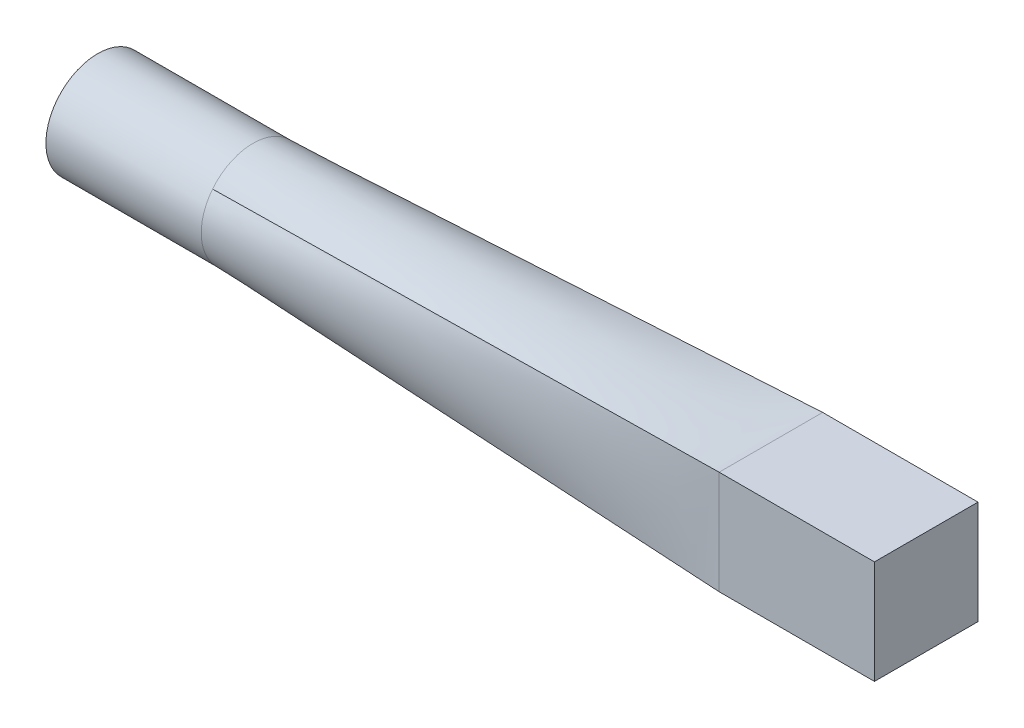
ISO-10303-21;
HEADER;
FILE_DESCRIPTION(('STEP AP214'),'2;1');
FILE_NAME('part.step','',(''),(''),'','','');
FILE_SCHEMA(('AUTOMOTIVE_DESIGN { 1 0 10303 214 1 1 1 1 }'));
ENDSEC;
DATA;
#1=APPLICATION_CONTEXT('core data for automotive mechanical design processes');
#2=APPLICATION_PROTOCOL_DEFINITION('international standard','automotive_design',2000,#1);
#3=PRODUCT_CONTEXT('',#1,'mechanical');
#4=PRODUCT('Part','Part','',(#3));
#5=PRODUCT_RELATED_PRODUCT_CATEGORY('part','',(#4));
#6=PRODUCT_DEFINITION_FORMATION('','',#4);
#7=PRODUCT_DEFINITION_CONTEXT('part definition',#1,'design');
#8=PRODUCT_DEFINITION('design','',#6,#7);
#9=PRODUCT_DEFINITION_SHAPE('','',#8);
#10=(LENGTH_UNIT() NAMED_UNIT(*) SI_UNIT(.MILLI.,.METRE.));
#11=(NAMED_UNIT(*) PLANE_ANGLE_UNIT() SI_UNIT($,.RADIAN.));
#12=(NAMED_UNIT(*) SI_UNIT($,.STERADIAN.) SOLID_ANGLE_UNIT());
#13=UNCERTAINTY_MEASURE_WITH_UNIT(LENGTH_MEASURE(1.E-05),#10,'distance_accuracy_value','');
#14=(GEOMETRIC_REPRESENTATION_CONTEXT(3) GLOBAL_UNCERTAINTY_ASSIGNED_CONTEXT((#13)) GLOBAL_UNIT_ASSIGNED_CONTEXT((#10,
#11,#12)) REPRESENTATION_CONTEXT('',''));
#15=CARTESIAN_POINT('',(0.,0.,0.));
#16=DIRECTION('',(0.,0.,1.));
#17=DIRECTION('',(1.,0.,0.));
#18=AXIS2_PLACEMENT_3D('',#15,#16,#17);
#19=CARTESIAN_POINT('',(1020.85832331262,102.108,102.108));
#20=CARTESIAN_POINT('',(680.378560960894,89.3341206385624,94.649650798203));
#21=CARTESIAN_POINT('',(339.898798609163,76.5602412771248,87.191301596406));
#22=CARTESIAN_POINT('',(-0.580963742567401,63.7863619156871,79.7329523946089));
#23=CARTESIAN_POINT('',(1020.85832331262,102.108,93.1714961454021));
#24=CARTESIAN_POINT('',(680.378560960894,91.2313128502488,87.1742277924552));
#25=CARTESIAN_POINT('',(339.898798609163,80.3546257004976,81.1769594395084));
#26=CARTESIAN_POINT('',(-0.580963742567401,69.4779385507464,75.1796910865616));
#27=CARTESIAN_POINT('',(1020.85832331262,102.108,75.7627085856291));
#28=CARTESIAN_POINT('',(680.378560960894,94.780774380712,72.0581179502453));
#29=CARTESIAN_POINT('',(339.898798609163,87.4535487614239,68.3535273148614));
#30=CARTESIAN_POINT('',(-0.580963742567402,80.1263231421359,64.6489366794776));
#31=CARTESIAN_POINT('',(1020.85832331262,102.108,54.6303952968601));
#32=CARTESIAN_POINT('',(680.378560960894,98.2373456468872,52.5513697085426));
#33=CARTESIAN_POINT('',(339.898798609163,94.3666912937744,50.4723441202251));
#34=CARTESIAN_POINT('',(-0.5809637425674,90.4960369406616,48.3933185319076));
#35=CARTESIAN_POINT('',(1020.85832331262,102.108,37.8649403420387));
#36=CARTESIAN_POINT('',(680.378560960894,100.23155182152,36.6096044345778));
#37=CARTESIAN_POINT('',(339.898798609163,98.3551036430404,35.3542685271169));
#38=CARTESIAN_POINT('',(-0.580963742567402,96.4786554645606,34.098932619656));
#39=CARTESIAN_POINT('',(1020.85832331262,102.108,25.3075183608059));
#40=CARTESIAN_POINT('',(680.378560960894,101.314918014343,24.5125273779682));
#41=CARTESIAN_POINT('',(339.898798609163,100.521836028686,23.7175363951305));
#42=CARTESIAN_POINT('',(-0.580963742567402,99.7287540430287,22.9225454122928));
#43=CARTESIAN_POINT('',(1020.85832331262,102.108,12.7132370112428));
#44=CARTESIAN_POINT('',(680.378560960894,101.965223533637,12.302421457231));
#45=CARTESIAN_POINT('',(339.898798609163,101.822447067274,11.8916059032192));
#46=CARTESIAN_POINT('',(-0.580963742567401,101.679670600911,11.4807903492074));
#47=CARTESIAN_POINT('',(1020.85832331262,102.108,4.25450000000002));
#48=CARTESIAN_POINT('',(680.378560960894,102.108,4.10708919991509));
#49=CARTESIAN_POINT('',(339.898798609163,102.108,3.95967839983017));
#50=CARTESIAN_POINT('',(-0.580963742567401,102.108,3.81226759974524));
#51=CARTESIAN_POINT('',(1020.85832331262,102.108,-4.2545));
#52=CARTESIAN_POINT('',(680.378560960894,102.108,-4.10708919991508));
#53=CARTESIAN_POINT('',(339.898798609163,102.108,-3.95967839983016));
#54=CARTESIAN_POINT('',(-0.580963742567401,102.108,-3.81226759974524));
#55=CARTESIAN_POINT('',(1020.85832331262,102.108,-12.7132370112428));
#56=CARTESIAN_POINT('',(680.378560960894,101.965223533637,-12.302421457231));
#57=CARTESIAN_POINT('',(339.898798609163,101.822447067274,-11.8916059032192));
#58=CARTESIAN_POINT('',(-0.580963742567401,101.679670600912,-11.4807903492074));
#59=CARTESIAN_POINT('',(1020.85832331262,102.108,-25.3075183608059));
#60=CARTESIAN_POINT('',(680.378560960894,101.314918014343,-24.5125273779682));
#61=CARTESIAN_POINT('',(339.898798609163,100.521836028686,-23.7175363951305));
#62=CARTESIAN_POINT('',(-0.580963742567401,99.7287540430285,-22.9225454122928));
#63=CARTESIAN_POINT('',(1020.85832331262,102.108,-37.8649403420387));
#64=CARTESIAN_POINT('',(680.378560960894,100.23155182152,-36.6096044345778));
#65=CARTESIAN_POINT('',(339.898798609163,98.3551036430405,-35.3542685271169));
#66=CARTESIAN_POINT('',(-0.580963742567402,96.4786554645607,-34.098932619656));
#67=CARTESIAN_POINT('',(1020.85832331262,102.108,-54.6303952968601));
#68=CARTESIAN_POINT('',(680.378560960894,98.2373456468873,-52.5513697085426));
#69=CARTESIAN_POINT('',(339.898798609163,94.3666912937745,-50.4723441202251));
#70=CARTESIAN_POINT('',(-0.5809637425674,90.4960369406616,-48.3933185319076));
#71=CARTESIAN_POINT('',(1020.85832331262,102.108,-75.7627085856291));
#72=CARTESIAN_POINT('',(680.378560960894,94.7807743807119,-72.0581179502453));
#73=CARTESIAN_POINT('',(339.898798609163,87.4535487614239,-68.3535273148615));
#74=CARTESIAN_POINT('',(-0.580963742567402,80.1263231421358,-64.6489366794777));
#75=CARTESIAN_POINT('',(1020.85832331262,102.108,-93.1714961454021));
#76=CARTESIAN_POINT('',(680.378560960894,91.2313128502488,-87.1742277924552));
#77=CARTESIAN_POINT('',(339.898798609163,80.3546257004976,-81.1769594395084));
#78=CARTESIAN_POINT('',(-0.580963742567401,69.4779385507464,-75.1796910865616));
#79=CARTESIAN_POINT('',(1020.85832331262,102.108,-102.108));
#80=CARTESIAN_POINT('',(680.378560960894,89.3341206385624,-94.649650798203));
#81=CARTESIAN_POINT('',(339.898798609163,76.5602412771248,-87.191301596406));
#82=CARTESIAN_POINT('',(-0.580963742567401,63.7863619156871,-79.732952394609));
#83=B_SPLINE_SURFACE_WITH_KNOTS('',3,3,((#19,#20,#21,#22),(#23,#24,#25,#26),(#27,#28,#29,#30),
(#31,#32,#33,#34),(#35,#36,#37,#38),(#39,#40,#41,#42),(#43,#44,#45,#46),(#47,#48,#49,#50),(#51,
#52,#53,#54),(#55,#56,#57,#58),(#59,#60,#61,#62),(#63,#64,#65,#66),(#67,#68,#69,#70),(#71,#72,
#73,#74),(#75,#76,#77,#78),(#79,#80,#81,#82)),.UNSPECIFIED.,.F.,.F.,.F.,(4,1,1,1,1,1,2,1,1,1,1,
1,4),(4,4),(0.732388356261361,0.765839811728691,0.799291267196021,0.816016994929686,
0.832742722663351,0.849468450397016,0.866194178130681,0.882919905864346,0.899645633598011,
0.916371361331675,0.93309708906534,0.96654854453267,1.),(0.,1.),.UNSPECIFIED.);
#84=DIRECTION('',(0.,0.,1.));
#85=VECTOR('',#84,1.);
#86=CARTESIAN_POINT('',(1020.85832331262,102.108,102.108));
#87=LINE('',#86,#85);
#88=CARTESIAN_POINT('',(1020.85832331262,102.108,-102.108));
#89=VERTEX_POINT('',#88);
#90=CARTESIAN_POINT('',(1020.85832331262,102.108,102.108));
#91=VERTEX_POINT('',#90);
#92=EDGE_CURVE('E190',#89,#91,#87,.T.);
#93=CARTESIAN_POINT('',(1020.85832331262,102.108,-102.108));
#94=CARTESIAN_POINT('',(680.378560960894,89.3341206385624,-94.649650798203));
#95=CARTESIAN_POINT('',(339.898798609163,76.5602412771248,-87.191301596406));
#96=CARTESIAN_POINT('',(-0.580963742567401,63.7863619156871,-79.732952394609));
#97=B_SPLINE_CURVE_WITH_KNOTS('',3,(#93,#94,#95,#96),.UNSPECIFIED.,.F.,.F.,(4,4),(0.,1.),.UNSPECIFIED.);
#98=CARTESIAN_POINT('',(-0.580963742567449,63.7867207358641,-79.7334010755995));
#99=VERTEX_POINT('',#98);
#100=EDGE_CURVE('E176',#89,#99,#97,.T.);
#101=CARTESIAN_POINT('',(-0.580963742567401,0.,0.));
#102=DIRECTION('',(1.,0.,0.));
#103=DIRECTION('',(0.,0.,-1.));
#104=AXIS2_PLACEMENT_3D('',#101,#102,#103);
#105=CIRCLE('',#104,102.108);
#106=CARTESIAN_POINT('',(-0.580963742567449,63.7867199650152,79.7334001299436));
#107=VERTEX_POINT('',#106);
#108=EDGE_CURVE('E167',#99,#107,#105,.T.);
#109=CARTESIAN_POINT('',(1020.85832331262,102.108,102.108));
#110=CARTESIAN_POINT('',(680.378560960894,89.3341206385624,94.649650798203));
#111=CARTESIAN_POINT('',(339.898798609163,76.5602412771248,87.191301596406));
#112=CARTESIAN_POINT('',(-0.580963742567401,63.7863619156871,79.7329523946089));
#113=B_SPLINE_CURVE_WITH_KNOTS('',3,(#109,#110,#111,#112),.UNSPECIFIED.,.F.,.F.,(4,4),(0.,1.),.UNSPECIFIED.);
#114=EDGE_CURVE('E192',#91,#107,#113,.T.);
#115=ORIENTED_EDGE('',*,*,#92,.F.);
#116=ORIENTED_EDGE('',*,*,#100,.T.);
#117=ORIENTED_EDGE('',*,*,#108,.T.);
#118=ORIENTED_EDGE('',*,*,#114,.F.);
#119=EDGE_LOOP('',(#115,#116,#117,#118));
#120=FACE_BOUND('',#119,.T.);
#121=ADVANCED_FACE('F115',(#120),#83,.T.);
#122=CARTESIAN_POINT('',(1020.85832331262,-102.108,102.108));
#123=CARTESIAN_POINT('',(680.378560960894,-94.2191794723762,89.8613162269803));
#124=CARTESIAN_POINT('',(339.898798609163,-86.3303589447525,77.6146324539605));
#125=CARTESIAN_POINT('',(-0.580963742567401,-78.4415384171288,65.3679486809408));
#126=CARTESIAN_POINT('',(1020.85832331262,-93.5989999999999,102.108));
#127=CARTESIAN_POINT('',(680.378560960894,-87.1385607456465,91.550858699056));
#128=CARTESIAN_POINT('',(339.898798609163,-80.678121491293,80.9937173981119));
#129=CARTESIAN_POINT('',(-0.580963742567401,-74.2176822369396,70.4365760971678));
#130=CARTESIAN_POINT('',(1020.85832331262,-76.5809999999999,102.108));
#131=CARTESIAN_POINT('',(680.378560960894,-72.6489037847377,94.6561958005782));
#132=CARTESIAN_POINT('',(339.898798609163,-68.7168075694755,87.2043916011564));
#133=CARTESIAN_POINT('',(-0.5809637425674,-64.7847113542132,79.7525874017347));
#134=CARTESIAN_POINT('',(1020.85832331262,-51.0539999999999,102.108));
#135=CARTESIAN_POINT('',(680.378560960894,-50.1052357931439,98.3182201109129));
#136=CARTESIAN_POINT('',(339.898798609163,-49.1564715862879,94.5284402218259));
#137=CARTESIAN_POINT('',(-0.580963742567404,-48.2077073794319,90.7386603327388));
#138=CARTESIAN_POINT('',(1020.85832331262,-25.5269999999999,102.108));
#139=CARTESIAN_POINT('',(680.378560960893,-26.9597121321166,100.847280584255));
#140=CARTESIAN_POINT('',(339.898798609163,-28.3924242642332,99.5865611685106));
#141=CARTESIAN_POINT('',(-0.580963742567398,-29.8251363963499,98.3258417527659));
#142=CARTESIAN_POINT('',(1020.85832331262,1.11889664200504E-13,102.108));
#143=CARTESIAN_POINT('',(680.378560960893,-3.44172585983409,102.148527394115));
#144=CARTESIAN_POINT('',(339.898798609163,-6.8834517196683,102.189054788229));
#145=CARTESIAN_POINT('',(-0.580963742567405,-10.3251775795025,102.229582182344));
#146=CARTESIAN_POINT('',(1020.85832331262,25.5270000000001,102.108));
#147=CARTESIAN_POINT('',(680.378560960893,20.2051843994744,102.173297821319));
#148=CARTESIAN_POINT('',(339.898798609163,14.8833687989486,102.238595642638));
#149=CARTESIAN_POINT('',(-0.5809637425674,9.5615531984229,102.303893463957));
#150=CARTESIAN_POINT('',(1020.85832331262,51.0540000000001,102.108));
#151=CARTESIAN_POINT('',(680.378560960894,43.7326679154101,100.920573809402));
#152=CARTESIAN_POINT('',(339.898798609163,36.4113358308201,99.7331476188032));
#153=CARTESIAN_POINT('',(-0.580963742567403,29.09000374623,98.5457214282048));
#154=CARTESIAN_POINT('',(1020.85832331262,76.581,102.108));
#155=CARTESIAN_POINT('',(680.378560960894,66.8969982660708,98.4374201646683));
#156=CARTESIAN_POINT('',(339.898798609163,57.2129965321415,94.7668403293366));
#157=CARTESIAN_POINT('',(-0.580963742567401,47.5289947982123,91.096260494005));
#158=CARTESIAN_POINT('',(1020.85832331262,93.599,102.108));
#159=CARTESIAN_POINT('',(680.378560960894,81.9440958958937,96.0235372590046));
#160=CARTESIAN_POINT('',(339.898798609163,70.2891917917873,89.9390745180092));
#161=CARTESIAN_POINT('',(-0.580963742567401,58.634287687681,83.8546117770139));
#162=CARTESIAN_POINT('',(1020.85832331262,102.108,102.108));
#163=CARTESIAN_POINT('',(680.378560960894,89.3341206385624,94.649650798203));
#164=CARTESIAN_POINT('',(339.898798609163,76.5602412771248,87.191301596406));
#165=CARTESIAN_POINT('',(-0.580963742567401,63.7863619156871,79.7329523946089));
#166=B_SPLINE_SURFACE_WITH_KNOTS('',3,3,((#122,#123,#124,#125),(#126,#127,#128,#129),(#130,#131,
#132,#133),(#134,#135,#136,#137),(#138,#139,#140,#141),(#142,#143,#144,#145),(#146,#147,#148,
#149),(#150,#151,#152,#153),(#154,#155,#156,#157),(#158,#159,#160,#161),(#162,#163,#164,#165)),
.UNSPECIFIED.,.F.,.F.,.F.,(4,1,1,1,1,1,1,1,4),(4,4),(0.483979693536605,0.515030776377199,
0.546081859217794,0.577132942058388,0.608184024898983,0.639235107739578,0.670286190580172,
0.701337273420767,0.732388356261361),(0.,1.),.UNSPECIFIED.);
#167=DIRECTION('',(0.,-1.,0.));
#168=VECTOR('',#167,1.);
#169=CARTESIAN_POINT('',(1020.85832331262,-102.108,102.108));
#170=LINE('',#169,#168);
#171=CARTESIAN_POINT('',(1020.85832331262,-102.108,102.108));
#172=VERTEX_POINT('',#171);
#173=EDGE_CURVE('E271',#91,#172,#170,.T.);
#174=CARTESIAN_POINT('',(-0.580963742567449,-78.4419910130422,65.3683259191906));
#175=VERTEX_POINT('',#174);
#176=EDGE_CURVE('E13',#107,#175,#105,.T.);
#177=CARTESIAN_POINT('',(1020.85832331262,-102.108,102.108));
#178=CARTESIAN_POINT('',(680.378560960894,-94.2191794723762,89.8613162269803));
#179=CARTESIAN_POINT('',(339.898798609163,-86.3303589447525,77.6146324539605));
#180=CARTESIAN_POINT('',(-0.580963742567401,-78.4415384171288,65.3679486809408));
#181=B_SPLINE_CURVE_WITH_KNOTS('',3,(#177,#178,#179,#180),.UNSPECIFIED.,.F.,.F.,(4,4),(0.,1.),.UNSPECIFIED.);
#182=EDGE_CURVE('E194',#172,#175,#181,.T.);
#183=ORIENTED_EDGE('',*,*,#173,.F.);
#184=ORIENTED_EDGE('',*,*,#114,.T.);
#185=ORIENTED_EDGE('',*,*,#176,.T.);
#186=ORIENTED_EDGE('',*,*,#182,.F.);
#187=EDGE_LOOP('',(#183,#184,#185,#186));
#188=FACE_BOUND('',#187,.T.);
#189=ADVANCED_FACE('F333',(#188),#166,.T.);
#190=CARTESIAN_POINT('',(1020.85832331262,-102.108,-102.108));
#191=CARTESIAN_POINT('',(680.378560960894,-94.2191794723762,-89.8613162269802));
#192=CARTESIAN_POINT('',(339.898798609163,-86.3303589447525,-77.6146324539604));
#193=CARTESIAN_POINT('',(-0.580963742567401,-78.4415384171289,-65.3679486809407));
#194=CARTESIAN_POINT('',(1020.85832331262,-102.108,-93.599));
#195=CARTESIAN_POINT('',(680.378560960894,-95.4806687955508,-82.6748623725041));
#196=CARTESIAN_POINT('',(339.898798609163,-88.8533375911017,-71.7507247450082));
#197=CARTESIAN_POINT('',(-0.580963742567401,-82.2260063866526,-60.8265871175122));
#198=CARTESIAN_POINT('',(1020.85832331262,-102.108,-76.581));
#199=CARTESIAN_POINT('',(680.378560960894,-97.740105900417,-68.0823739923743));
#200=CARTESIAN_POINT('',(339.898798609163,-93.3722118008341,-59.5837479847486));
#201=CARTESIAN_POINT('',(-0.580963742567401,-89.0043177012512,-51.085121977123));
#202=CARTESIAN_POINT('',(1020.85832331262,-102.108,-51.054));
#203=CARTESIAN_POINT('',(680.378560960894,-100.236419088233,-45.6811188602736));
#204=CARTESIAN_POINT('',(339.898798609163,-98.3648381764663,-40.3082377205471));
#205=CARTESIAN_POINT('',(-0.580963742567401,-96.4932572646995,-34.9353565808207));
#206=CARTESIAN_POINT('',(1020.85832331262,-102.108,-25.527));
#207=CARTESIAN_POINT('',(680.378560960894,-101.764942367677,-22.9295112801348));
#208=CARTESIAN_POINT('',(339.898798609163,-101.421884735355,-20.3320225602695));
#209=CARTESIAN_POINT('',(-0.580963742567403,-101.078827103032,-17.7345338404043));
#210=CARTESIAN_POINT('',(1020.85832331262,-102.108,0.));
#211=CARTESIAN_POINT('',(680.378560960893,-102.27959121097,0.));
#212=CARTESIAN_POINT('',(339.898798609163,-102.45118242194,0.));
#213=CARTESIAN_POINT('',(-0.580963742567399,-102.62277363291,0.));
#214=CARTESIAN_POINT('',(1020.85832331262,-102.108,25.527));
#215=CARTESIAN_POINT('',(680.378560960893,-101.764942367677,22.9295112801348));
#216=CARTESIAN_POINT('',(339.898798609163,-101.421884735355,20.3320225602696));
#217=CARTESIAN_POINT('',(-0.580963742567405,-101.078827103032,17.7345338404044));
#218=CARTESIAN_POINT('',(1020.85832331262,-102.108,51.054));
#219=CARTESIAN_POINT('',(680.378560960894,-100.236419088233,45.6811188602736));
#220=CARTESIAN_POINT('',(339.898798609163,-98.3648381764663,40.3082377205473));
#221=CARTESIAN_POINT('',(-0.580963742567399,-96.4932572646995,34.9353565808209));
#222=CARTESIAN_POINT('',(1020.85832331262,-102.108,76.581));
#223=CARTESIAN_POINT('',(680.378560960893,-97.740105900417,68.0823739923743));
#224=CARTESIAN_POINT('',(339.898798609163,-93.3722118008341,59.5837479847486));
#225=CARTESIAN_POINT('',(-0.580963742567403,-89.0043177012512,51.0851219771229));
#226=CARTESIAN_POINT('',(1020.85832331262,-102.108,93.599));
#227=CARTESIAN_POINT('',(680.378560960893,-95.4806687955508,82.6748623725041));
#228=CARTESIAN_POINT('',(339.898798609163,-88.8533375911016,71.7507247450082));
#229=CARTESIAN_POINT('',(-0.580963742567401,-82.2260063866525,60.8265871175123));
#230=CARTESIAN_POINT('',(1020.85832331262,-102.108,102.108));
#231=CARTESIAN_POINT('',(680.378560960894,-94.2191794723762,89.8613162269803));
#232=CARTESIAN_POINT('',(339.898798609163,-86.3303589447525,77.6146324539605));
#233=CARTESIAN_POINT('',(-0.580963742567401,-78.4415384171288,65.3679486809408));
#234=B_SPLINE_SURFACE_WITH_KNOTS('',3,3,((#190,#191,#192,#193),(#194,#195,#196,#197),(#198,#199,
#200,#201),(#202,#203,#204,#205),(#206,#207,#208,#209),(#210,#211,#212,#213),(#214,#215,#216,
#217),(#218,#219,#220,#221),(#222,#223,#224,#225),(#226,#227,#228,#229),(#230,#231,#232,#233)),
.UNSPECIFIED.,.F.,.F.,.F.,(4,1,1,1,1,1,1,1,4),(4,4),(0.248408662724757,0.277855041576238,
0.307301420427719,0.3367477992792,0.366194178130681,0.395640556982162,0.425086935833643,
0.454533314685124,0.483979693536605),(0.,1.),.UNSPECIFIED.);
#235=DIRECTION('',(0.,0.,-1.));
#236=VECTOR('',#235,1.);
#237=CARTESIAN_POINT('',(1020.85832331262,-102.108,102.108));
#238=LINE('',#237,#236);
#239=CARTESIAN_POINT('',(1020.85832331262,-102.108,-102.108));
#240=VERTEX_POINT('',#239);
#241=EDGE_CURVE('E302',#172,#240,#238,.T.);
#242=CARTESIAN_POINT('',(-0.580963742567449,-78.4419888320104,-65.368324117985));
#243=VERTEX_POINT('',#242);
#244=EDGE_CURVE('E128',#175,#243,#105,.T.);
#245=CARTESIAN_POINT('',(1020.85832331262,-102.108,-102.108));
#246=CARTESIAN_POINT('',(680.378560960894,-94.2191794723762,-89.8613162269802));
#247=CARTESIAN_POINT('',(339.898798609163,-86.3303589447525,-77.6146324539604));
#248=CARTESIAN_POINT('',(-0.580963742567401,-78.4415384171289,-65.3679486809407));
#249=B_SPLINE_CURVE_WITH_KNOTS('',3,(#245,#246,#247,#248),.UNSPECIFIED.,.F.,.F.,(4,4),(0.,1.),.UNSPECIFIED.);
#250=EDGE_CURVE('E186',#240,#243,#249,.T.);
#251=ORIENTED_EDGE('',*,*,#241,.F.);
#252=ORIENTED_EDGE('',*,*,#182,.T.);
#253=ORIENTED_EDGE('',*,*,#244,.T.);
#254=ORIENTED_EDGE('',*,*,#250,.F.);
#255=EDGE_LOOP('',(#251,#252,#253,#254));
#256=FACE_BOUND('',#255,.T.);
#257=ADVANCED_FACE('F227',(#256),#234,.T.);
#258=CARTESIAN_POINT('',(1020.85832331262,102.108,-102.108));
#259=CARTESIAN_POINT('',(680.378560960894,89.3341206385624,-94.649650798203));
#260=CARTESIAN_POINT('',(339.898798609163,76.5602412771248,-87.191301596406));
#261=CARTESIAN_POINT('',(-0.580963742567401,63.7863619156871,-79.732952394609));
#262=CARTESIAN_POINT('',(1020.85832331262,93.5990000000001,-102.108));
#263=CARTESIAN_POINT('',(680.378560960894,81.9440958958937,-96.0235372590046));
#264=CARTESIAN_POINT('',(339.898798609163,70.2891917917873,-89.9390745180092));
#265=CARTESIAN_POINT('',(-0.580963742567401,58.634287687681,-83.8546117770139));
#266=CARTESIAN_POINT('',(1020.85832331262,76.581,-102.108));
#267=CARTESIAN_POINT('',(680.378560960894,66.8969982660708,-98.4374201646683));
#268=CARTESIAN_POINT('',(339.898798609163,57.2129965321415,-94.7668403293366));
#269=CARTESIAN_POINT('',(-0.580963742567401,47.5289947982122,-91.0962604940049));
#270=CARTESIAN_POINT('',(1020.85832331262,51.0540000000001,-102.108));
#271=CARTESIAN_POINT('',(680.378560960894,43.7326679154101,-100.920573809402));
#272=CARTESIAN_POINT('',(339.898798609163,36.4113358308201,-99.7331476188033));
#273=CARTESIAN_POINT('',(-0.580963742567403,29.0900037462301,-98.545721428205));
#274=CARTESIAN_POINT('',(1020.85832331262,25.5270000000001,-102.108));
#275=CARTESIAN_POINT('',(680.378560960894,20.2051843994743,-102.173297821319));
#276=CARTESIAN_POINT('',(339.898798609163,14.8833687989486,-102.238595642638));
#277=CARTESIAN_POINT('',(-0.5809637425674,9.56155319842282,-102.303893463957));
#278=CARTESIAN_POINT('',(1020.85832331262,0.,-102.108));
#279=CARTESIAN_POINT('',(680.378560960893,-3.44172585983412,-102.148527394114));
#280=CARTESIAN_POINT('',(339.898798609163,-6.88345171966832,-102.189054788229));
#281=CARTESIAN_POINT('',(-0.580963742567404,-10.3251775795025,-102.229582182343));
#282=CARTESIAN_POINT('',(1020.85832331262,-25.5269999999999,-102.108));
#283=CARTESIAN_POINT('',(680.378560960894,-26.9597121321167,-100.847280584255));
#284=CARTESIAN_POINT('',(339.898798609163,-28.3924242642334,-99.5865611685108));
#285=CARTESIAN_POINT('',(-0.580963742567399,-29.8251363963502,-98.3258417527663));
#286=CARTESIAN_POINT('',(1020.85832331262,-51.0539999999999,-102.108));
#287=CARTESIAN_POINT('',(680.378560960894,-50.1052357931439,-98.3182201109128));
#288=CARTESIAN_POINT('',(339.898798609163,-49.1564715862878,-94.5284402218256));
#289=CARTESIAN_POINT('',(-0.580963742567402,-48.2077073794318,-90.7386603327383));
#290=CARTESIAN_POINT('',(1020.85832331262,-76.5809999999999,-102.108));
#291=CARTESIAN_POINT('',(680.378560960894,-72.6489037847378,-94.6561958005783));
#292=CARTESIAN_POINT('',(339.898798609163,-68.7168075694756,-87.2043916011567));
#293=CARTESIAN_POINT('',(-0.580963742567401,-64.7847113542134,-79.752587401735));
#294=CARTESIAN_POINT('',(1020.85832331262,-93.5989999999999,-102.108));
#295=CARTESIAN_POINT('',(680.378560960894,-87.1385607456465,-91.5508586990559));
#296=CARTESIAN_POINT('',(339.898798609163,-80.6781214912931,-80.9937173981118));
#297=CARTESIAN_POINT('',(-0.580963742567401,-74.2176822369397,-70.4365760971677));
#298=CARTESIAN_POINT('',(1020.85832331262,-102.108,-102.108));
#299=CARTESIAN_POINT('',(680.378560960894,-94.2191794723762,-89.8613162269802));
#300=CARTESIAN_POINT('',(339.898798609163,-86.3303589447525,-77.6146324539604));
#301=CARTESIAN_POINT('',(-0.580963742567401,-78.4415384171289,-65.3679486809407));
#302=B_SPLINE_SURFACE_WITH_KNOTS('',3,3,((#258,#259,#260,#261),(#262,#263,#264,#265),(#266,#267,
#268,#269),(#270,#271,#272,#273),(#274,#275,#276,#277),(#278,#279,#280,#281),(#282,#283,#284,
#285),(#286,#287,#288,#289),(#290,#291,#292,#293),(#294,#295,#296,#297),(#298,#299,#300,#301)),
.UNSPECIFIED.,.F.,.F.,.F.,(4,1,1,1,1,1,1,1,4),(4,4),(0.,0.0310510828405946,0.0621021656811892,
0.0931532485217838,0.124204331362378,0.155255414202973,0.186306497043568,0.217357579884162,
0.248408662724757),(0.,1.),.UNSPECIFIED.);
#303=DIRECTION('',(0.,1.,0.));
#304=VECTOR('',#303,1.);
#305=CARTESIAN_POINT('',(1020.85832331262,-102.108,-102.108));
#306=LINE('',#305,#304);
#307=EDGE_CURVE('E209',#240,#89,#306,.T.);
#308=EDGE_CURVE('E121',#243,#99,#105,.T.);
#309=ORIENTED_EDGE('',*,*,#307,.F.);
#310=ORIENTED_EDGE('',*,*,#250,.T.);
#311=ORIENTED_EDGE('',*,*,#308,.T.);
#312=ORIENTED_EDGE('',*,*,#100,.F.);
#313=EDGE_LOOP('',(#309,#310,#311,#312));
#314=FACE_BOUND('',#313,.T.);
#315=ADVANCED_FACE('F184',(#314),#302,.T.);
#316=CARTESIAN_POINT('',(1327.18232331262,-102.108,-102.108));
#317=DIRECTION('',(0.,0.,1.));
#318=DIRECTION('',(1.,0.,0.));
#319=AXIS2_PLACEMENT_3D('',#316,#317,#318);
#320=PLANE('',#319);
#321=ORIENTED_EDGE('',*,*,#307,.T.);
#322=DIRECTION('',(-1.,0.,0.));
#323=VECTOR('',#322,1.);
#324=CARTESIAN_POINT('',(1327.18232331262,102.108,-102.108));
#325=LINE('',#324,#323);
#326=CARTESIAN_POINT('',(1327.18232331262,102.108,-102.108));
#327=VERTEX_POINT('',#326);
#328=EDGE_CURVE('E257',#327,#89,#325,.T.);
#329=ORIENTED_EDGE('',*,*,#328,.F.);
#330=DIRECTION('',(0.,1.,0.));
#331=VECTOR('',#330,1.);
#332=CARTESIAN_POINT('',(1327.18232331262,-102.108,-102.108));
#333=LINE('',#332,#331);
#334=CARTESIAN_POINT('',(1327.18232331262,-102.108,-102.108));
#335=VERTEX_POINT('',#334);
#336=EDGE_CURVE('E284',#335,#327,#333,.T.);
#337=ORIENTED_EDGE('',*,*,#336,.F.);
#338=DIRECTION('',(-1.,0.,0.));
#339=VECTOR('',#338,1.);
#340=CARTESIAN_POINT('',(1327.18232331262,-102.108,-102.108));
#341=LINE('',#340,#339);
#342=EDGE_CURVE('E266',#335,#240,#341,.T.);
#343=ORIENTED_EDGE('',*,*,#342,.T.);
#344=EDGE_LOOP('',(#321,#329,#337,#343));
#345=FACE_BOUND('',#344,.T.);
#346=ADVANCED_FACE('F226',(#345),#320,.F.);
#347=CARTESIAN_POINT('',(1327.18232331262,102.108,102.108));
#348=DIRECTION('',(0.,-1.,0.));
#349=DIRECTION('',(0.,0.,-1.));
#350=AXIS2_PLACEMENT_3D('',#347,#348,#349);
#351=PLANE('',#350);
#352=ORIENTED_EDGE('',*,*,#92,.T.);
#353=DIRECTION('',(-1.,0.,0.));
#354=VECTOR('',#353,1.);
#355=CARTESIAN_POINT('',(1327.18232331262,102.108,102.108));
#356=LINE('',#355,#354);
#357=CARTESIAN_POINT('',(1327.18232331262,102.108,102.108));
#358=VERTEX_POINT('',#357);
#359=EDGE_CURVE('E276',#358,#91,#356,.T.);
#360=ORIENTED_EDGE('',*,*,#359,.F.);
#361=DIRECTION('',(0.,0.,1.));
#362=VECTOR('',#361,1.);
#363=CARTESIAN_POINT('',(1327.18232331262,102.108,102.108));
#364=LINE('',#363,#362);
#365=EDGE_CURVE('E294',#327,#358,#364,.T.);
#366=ORIENTED_EDGE('',*,*,#365,.F.);
#367=ORIENTED_EDGE('',*,*,#328,.T.);
#368=EDGE_LOOP('',(#352,#360,#366,#367));
#369=FACE_BOUND('',#368,.T.);
#370=ADVANCED_FACE('F430',(#369),#351,.F.);
#371=CARTESIAN_POINT('',(1327.18232331262,-102.108,102.108));
#372=DIRECTION('',(0.,0.,-1.));
#373=DIRECTION('',(-1.,0.,0.));
#374=AXIS2_PLACEMENT_3D('',#371,#372,#373);
#375=PLANE('',#374);
#376=ORIENTED_EDGE('',*,*,#173,.T.);
#377=DIRECTION('',(-1.,0.,0.));
#378=VECTOR('',#377,1.);
#379=CARTESIAN_POINT('',(1327.18232331262,-102.108,102.108));
#380=LINE('',#379,#378);
#381=CARTESIAN_POINT('',(1327.18232331262,-102.108,102.108));
#382=VERTEX_POINT('',#381);
#383=EDGE_CURVE('E287',#382,#172,#380,.T.);
#384=ORIENTED_EDGE('',*,*,#383,.F.);
#385=DIRECTION('',(0.,-1.,0.));
#386=VECTOR('',#385,1.);
#387=CARTESIAN_POINT('',(1327.18232331262,-102.108,102.108));
#388=LINE('',#387,#386);
#389=EDGE_CURVE('E291',#358,#382,#388,.T.);
#390=ORIENTED_EDGE('',*,*,#389,.F.);
#391=ORIENTED_EDGE('',*,*,#359,.T.);
#392=EDGE_LOOP('',(#376,#384,#390,#391));
#393=FACE_BOUND('',#392,.T.);
#394=ADVANCED_FACE('F398',(#393),#375,.F.);
#395=CARTESIAN_POINT('',(1327.18232331262,-102.108,102.108));
#396=DIRECTION('',(0.,1.,0.));
#397=DIRECTION('',(0.,0.,1.));
#398=AXIS2_PLACEMENT_3D('',#395,#396,#397);
#399=PLANE('',#398);
#400=ORIENTED_EDGE('',*,*,#241,.T.);
#401=ORIENTED_EDGE('',*,*,#342,.F.);
#402=DIRECTION('',(0.,0.,-1.));
#403=VECTOR('',#402,1.);
#404=CARTESIAN_POINT('',(1327.18232331262,-102.108,102.108));
#405=LINE('',#404,#403);
#406=EDGE_CURVE('E288',#382,#335,#405,.T.);
#407=ORIENTED_EDGE('',*,*,#406,.F.);
#408=ORIENTED_EDGE('',*,*,#383,.T.);
#409=EDGE_LOOP('',(#400,#401,#407,#408));
#410=FACE_BOUND('',#409,.T.);
#411=ADVANCED_FACE('F394',(#410),#399,.F.);
#412=CARTESIAN_POINT('',(1327.18232331262,0.,0.));
#413=DIRECTION('',(-1.,0.,0.));
#414=DIRECTION('',(0.,0.,1.));
#415=AXIS2_PLACEMENT_3D('',#412,#413,#414);
#416=PLANE('',#415);
#417=ORIENTED_EDGE('',*,*,#336,.T.);
#418=ORIENTED_EDGE('',*,*,#365,.T.);
#419=ORIENTED_EDGE('',*,*,#389,.T.);
#420=ORIENTED_EDGE('',*,*,#406,.T.);
#421=EDGE_LOOP('',(#417,#418,#419,#420));
#422=FACE_BOUND('',#421,.T.);
#423=ADVANCED_FACE('F390',(#422),#416,.F.);
#424=CARTESIAN_POINT('',(-306.904963742567,0.,0.));
#425=DIRECTION('',(1.,0.,0.));
#426=DIRECTION('',(0.,0.,-1.));
#427=AXIS2_PLACEMENT_3D('',#424,#425,#426);
#428=CYLINDRICAL_SURFACE('',#427,102.108);
#429=CARTESIAN_POINT('',(-306.904963742567,0.,0.));
#430=DIRECTION('',(1.,0.,0.));
#431=DIRECTION('',(0.,0.,-1.));
#432=AXIS2_PLACEMENT_3D('',#429,#430,#431);
#433=CIRCLE('',#432,102.108);
#434=CARTESIAN_POINT('',(-306.904963742567,0.,-102.108));
#435=VERTEX_POINT('',#434);
#436=EDGE_CURVE('E432',#435,#435,#433,.T.);
#437=ORIENTED_EDGE('',*,*,#436,.T.);
#438=EDGE_LOOP('',(#437));
#439=FACE_BOUND('',#438,.T.);
#440=ORIENTED_EDGE('',*,*,#108,.F.);
#441=ORIENTED_EDGE('',*,*,#308,.F.);
#442=ORIENTED_EDGE('',*,*,#244,.F.);
#443=ORIENTED_EDGE('',*,*,#176,.F.);
#444=EDGE_LOOP('',(#440,#441,#442,#443));
#445=FACE_BOUND('',#444,.T.);
#446=ADVANCED_FACE('F169',(#439,#445),#428,.T.);
#447=CARTESIAN_POINT('',(-306.904963742567,0.,0.));
#448=DIRECTION('',(1.,0.,0.));
#449=DIRECTION('',(0.,0.,-1.));
#450=AXIS2_PLACEMENT_3D('',#447,#448,#449);
#451=PLANE('',#450);
#452=ORIENTED_EDGE('',*,*,#436,.F.);
#453=EDGE_LOOP('',(#452));
#454=FACE_BOUND('',#453,.T.);
#455=ADVANCED_FACE('F389',(#454),#451,.F.);
#456=CLOSED_SHELL('',(#121,#189,#257,#315,#346,#370,#394,#411,#423,#446,#455));
#457=MANIFOLD_SOLID_BREP('B2',#456);
#458=ADVANCED_BREP_SHAPE_REPRESENTATION('',(#18,#457),#14);
#459=SHAPE_DEFINITION_REPRESENTATION(#9,#458);
ENDSEC;
END-ISO-10303-21;
